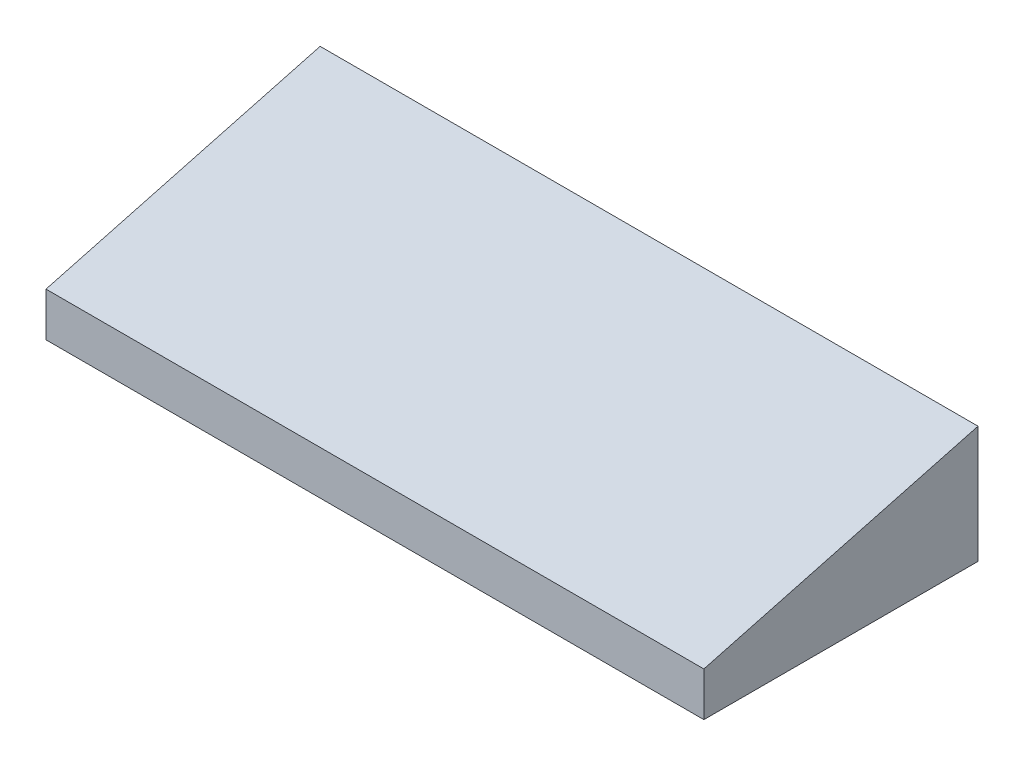
ISO-10303-21;
HEADER;
FILE_DESCRIPTION(('STEP AP214'),'2;1');
FILE_NAME('part.step','',(''),(''),'','','');
FILE_SCHEMA(('AUTOMOTIVE_DESIGN { 1 0 10303 214 1 1 1 1 }'));
ENDSEC;
DATA;
#1=APPLICATION_CONTEXT('core data for automotive mechanical design processes');
#2=APPLICATION_PROTOCOL_DEFINITION('international standard','automotive_design',2000,#1);
#3=PRODUCT_CONTEXT('',#1,'mechanical');
#4=PRODUCT('Part','Part','',(#3));
#5=PRODUCT_RELATED_PRODUCT_CATEGORY('part','',(#4));
#6=PRODUCT_DEFINITION_FORMATION('','',#4);
#7=PRODUCT_DEFINITION_CONTEXT('part definition',#1,'design');
#8=PRODUCT_DEFINITION('design','',#6,#7);
#9=PRODUCT_DEFINITION_SHAPE('','',#8);
#10=(LENGTH_UNIT() NAMED_UNIT(*) SI_UNIT(.MILLI.,.METRE.));
#11=(NAMED_UNIT(*) PLANE_ANGLE_UNIT() SI_UNIT($,.RADIAN.));
#12=(NAMED_UNIT(*) SI_UNIT($,.STERADIAN.) SOLID_ANGLE_UNIT());
#13=UNCERTAINTY_MEASURE_WITH_UNIT(LENGTH_MEASURE(1.E-05),#10,'distance_accuracy_value','');
#14=(GEOMETRIC_REPRESENTATION_CONTEXT(3) GLOBAL_UNCERTAINTY_ASSIGNED_CONTEXT((#13)) GLOBAL_UNIT_ASSIGNED_CONTEXT((#10,
#11,#12)) REPRESENTATION_CONTEXT('',''));
#15=CARTESIAN_POINT('',(0.,0.,0.));
#16=DIRECTION('',(0.,0.,1.));
#17=DIRECTION('',(1.,0.,0.));
#18=AXIS2_PLACEMENT_3D('',#15,#16,#17);
#19=CARTESIAN_POINT('',(-60.,9.96975479507664,2.66206502128796));
#20=DIRECTION('',(0.,-0.966151320688328,-0.257976017358589));
#21=DIRECTION('',(0.,0.257976017358589,-0.966151320688328));
#22=AXIS2_PLACEMENT_3D('',#19,#20,#21);
#23=PLANE('',#22);
#24=DIRECTION('',(1.,0.,0.));
#25=VECTOR('',#24,1.);
#26=CARTESIAN_POINT('',(-60.,8.01042275162846,10.));
#27=LINE('',#26,#25);
#28=CARTESIAN_POINT('',(-60.,8.01042275162846,10.));
#29=VERTEX_POINT('',#28);
#30=CARTESIAN_POINT('',(60.,8.01042275162846,10.));
#31=VERTEX_POINT('',#30);
#32=EDGE_CURVE('E44',#29,#31,#27,.T.);
#33=ORIENTED_EDGE('',*,*,#32,.T.);
#34=DIRECTION('',(0.,0.257976017358589,-0.966151320688328));
#35=VECTOR('',#34,1.);
#36=CARTESIAN_POINT('',(60.,9.96975479507664,2.66206502128796));
#37=LINE('',#36,#35);
#38=CARTESIAN_POINT('',(60.,21.3611273376759,-40.));
#39=VERTEX_POINT('',#38);
#40=EDGE_CURVE('E84',#31,#39,#37,.T.);
#41=ORIENTED_EDGE('',*,*,#40,.T.);
#42=DIRECTION('',(1.,0.,0.));
#43=VECTOR('',#42,1.);
#44=CARTESIAN_POINT('',(-60.,21.3611273376759,-40.));
#45=LINE('',#44,#43);
#46=CARTESIAN_POINT('',(-60.,21.3611273376759,-40.));
#47=VERTEX_POINT('',#46);
#48=EDGE_CURVE('E11',#47,#39,#45,.T.);
#49=ORIENTED_EDGE('',*,*,#48,.F.);
#50=DIRECTION('',(0.,0.257976017358589,-0.966151320688328));
#51=VECTOR('',#50,1.);
#52=CARTESIAN_POINT('',(-60.,9.96975479507664,2.66206502128796));
#53=LINE('',#52,#51);
#54=EDGE_CURVE('E86',#29,#47,#53,.T.);
#55=ORIENTED_EDGE('',*,*,#54,.F.);
#56=EDGE_LOOP('',(#33,#41,#49,#55));
#57=FACE_BOUND('',#56,.T.);
#58=ADVANCED_FACE('F41',(#57),#23,.F.);
#59=CARTESIAN_POINT('',(-60.,0.,-40.));
#60=DIRECTION('',(0.,0.,1.));
#61=DIRECTION('',(1.,0.,0.));
#62=AXIS2_PLACEMENT_3D('',#59,#60,#61);
#63=PLANE('',#62);
#64=ORIENTED_EDGE('',*,*,#48,.T.);
#65=DIRECTION('',(0.,-1.,0.));
#66=VECTOR('',#65,1.);
#67=CARTESIAN_POINT('',(60.,0.,-40.));
#68=LINE('',#67,#66);
#69=CARTESIAN_POINT('',(60.,0.,-40.));
#70=VERTEX_POINT('',#69);
#71=EDGE_CURVE('E103',#39,#70,#68,.T.);
#72=ORIENTED_EDGE('',*,*,#71,.T.);
#73=DIRECTION('',(1.,0.,0.));
#74=VECTOR('',#73,1.);
#75=CARTESIAN_POINT('',(-60.,0.,-40.));
#76=LINE('',#75,#74);
#77=CARTESIAN_POINT('',(-60.,0.,-40.));
#78=VERTEX_POINT('',#77);
#79=EDGE_CURVE('E50',#78,#70,#76,.T.);
#80=ORIENTED_EDGE('',*,*,#79,.F.);
#81=DIRECTION('',(0.,-1.,0.));
#82=VECTOR('',#81,1.);
#83=CARTESIAN_POINT('',(-60.,0.,-40.));
#84=LINE('',#83,#82);
#85=EDGE_CURVE('E57',#47,#78,#84,.T.);
#86=ORIENTED_EDGE('',*,*,#85,.F.);
#87=EDGE_LOOP('',(#64,#72,#80,#86));
#88=FACE_BOUND('',#87,.T.);
#89=ADVANCED_FACE('F126',(#88),#63,.F.);
#90=CARTESIAN_POINT('',(-60.,0.,0.));
#91=DIRECTION('',(0.,-1.,0.));
#92=DIRECTION('',(0.,0.,-1.));
#93=AXIS2_PLACEMENT_3D('',#90,#91,#92);
#94=PLANE('',#93);
#95=ORIENTED_EDGE('',*,*,#79,.T.);
#96=DIRECTION('',(0.,0.,-1.));
#97=VECTOR('',#96,1.);
#98=CARTESIAN_POINT('',(60.,0.,0.));
#99=LINE('',#98,#97);
#100=CARTESIAN_POINT('',(60.,0.,10.));
#101=VERTEX_POINT('',#100);
#102=EDGE_CURVE('E99',#101,#70,#99,.T.);
#103=ORIENTED_EDGE('',*,*,#102,.F.);
#104=DIRECTION('',(1.,0.,0.));
#105=VECTOR('',#104,1.);
#106=CARTESIAN_POINT('',(-60.,0.,10.));
#107=LINE('',#106,#105);
#108=CARTESIAN_POINT('',(-60.,0.,10.));
#109=VERTEX_POINT('',#108);
#110=EDGE_CURVE('E91',#109,#101,#107,.T.);
#111=ORIENTED_EDGE('',*,*,#110,.F.);
#112=DIRECTION('',(0.,0.,-1.));
#113=VECTOR('',#112,1.);
#114=CARTESIAN_POINT('',(-60.,0.,0.));
#115=LINE('',#114,#113);
#116=EDGE_CURVE('E116',#109,#78,#115,.T.);
#117=ORIENTED_EDGE('',*,*,#116,.T.);
#118=EDGE_LOOP('',(#95,#103,#111,#117));
#119=FACE_BOUND('',#118,.T.);
#120=ADVANCED_FACE('F125',(#119),#94,.T.);
#121=CARTESIAN_POINT('',(-60.,0.,10.));
#122=DIRECTION('',(0.,0.,1.));
#123=DIRECTION('',(0.,-1.,0.));
#124=AXIS2_PLACEMENT_3D('',#121,#122,#123);
#125=PLANE('',#124);
#126=ORIENTED_EDGE('',*,*,#110,.T.);
#127=DIRECTION('',(0.,-1.,0.));
#128=VECTOR('',#127,1.);
#129=CARTESIAN_POINT('',(60.,0.,10.));
#130=LINE('',#129,#128);
#131=EDGE_CURVE('E93',#31,#101,#130,.T.);
#132=ORIENTED_EDGE('',*,*,#131,.F.);
#133=ORIENTED_EDGE('',*,*,#32,.F.);
#134=DIRECTION('',(0.,-1.,0.));
#135=VECTOR('',#134,1.);
#136=CARTESIAN_POINT('',(-60.,0.,10.));
#137=LINE('',#136,#135);
#138=EDGE_CURVE('E113',#29,#109,#137,.T.);
#139=ORIENTED_EDGE('',*,*,#138,.T.);
#140=EDGE_LOOP('',(#126,#132,#133,#139));
#141=FACE_BOUND('',#140,.T.);
#142=ADVANCED_FACE('F94',(#141),#125,.T.);
#143=CARTESIAN_POINT('',(-60.,0.,0.));
#144=DIRECTION('',(1.,0.,0.));
#145=DIRECTION('',(0.,0.,-1.));
#146=AXIS2_PLACEMENT_3D('',#143,#144,#145);
#147=PLANE('',#146);
#148=ORIENTED_EDGE('',*,*,#54,.T.);
#149=ORIENTED_EDGE('',*,*,#85,.T.);
#150=ORIENTED_EDGE('',*,*,#116,.F.);
#151=ORIENTED_EDGE('',*,*,#138,.F.);
#152=EDGE_LOOP('',(#148,#149,#150,#151));
#153=FACE_BOUND('',#152,.T.);
#154=ADVANCED_FACE('F135',(#153),#147,.F.);
#155=CARTESIAN_POINT('',(60.,0.,0.));
#156=DIRECTION('',(1.,0.,0.));
#157=DIRECTION('',(0.,0.,-1.));
#158=AXIS2_PLACEMENT_3D('',#155,#156,#157);
#159=PLANE('',#158);
#160=ORIENTED_EDGE('',*,*,#40,.F.);
#161=ORIENTED_EDGE('',*,*,#131,.T.);
#162=ORIENTED_EDGE('',*,*,#102,.T.);
#163=ORIENTED_EDGE('',*,*,#71,.F.);
#164=EDGE_LOOP('',(#160,#161,#162,#163));
#165=FACE_BOUND('',#164,.T.);
#166=ADVANCED_FACE('F101',(#165),#159,.T.);
#167=CLOSED_SHELL('',(#58,#89,#120,#142,#154,#166));
#168=MANIFOLD_SOLID_BREP('B2',#167);
#169=ADVANCED_BREP_SHAPE_REPRESENTATION('',(#18,#168),#14);
#170=SHAPE_DEFINITION_REPRESENTATION(#9,#169);
ENDSEC;
END-ISO-10303-21;
